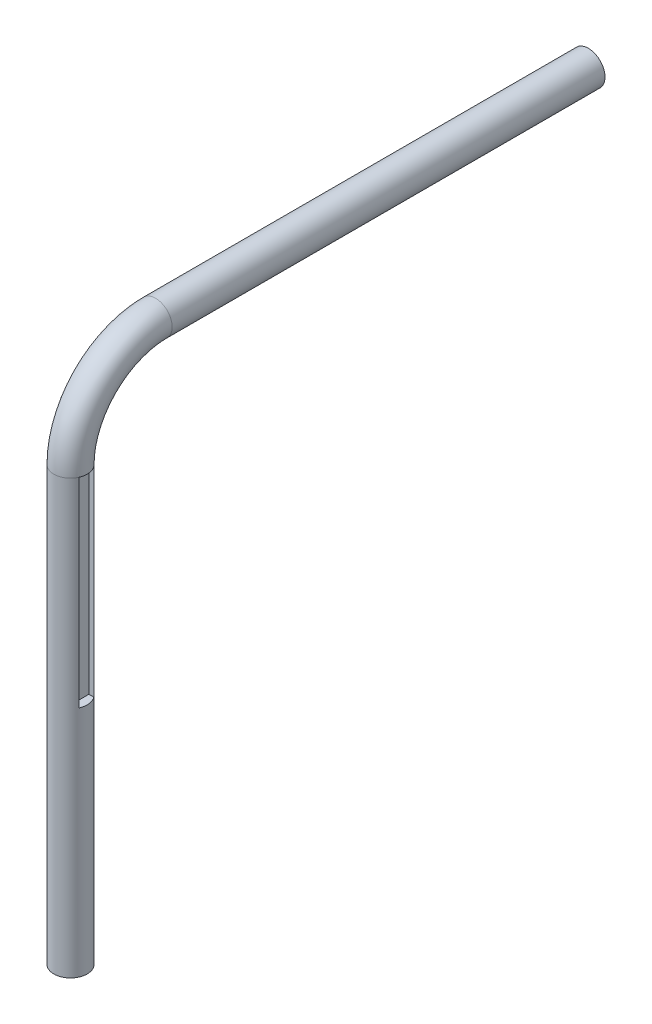
ISO-10303-21;
HEADER;
FILE_DESCRIPTION(('STEP AP214'),'2;1');
FILE_NAME('part.step','',(''),(''),'','','');
FILE_SCHEMA(('AUTOMOTIVE_DESIGN { 1 0 10303 214 1 1 1 1 }'));
ENDSEC;
DATA;
#1=APPLICATION_CONTEXT('core data for automotive mechanical design processes');
#2=APPLICATION_PROTOCOL_DEFINITION('international standard','automotive_design',2000,#1);
#3=PRODUCT_CONTEXT('',#1,'mechanical');
#4=PRODUCT('Part','Part','',(#3));
#5=PRODUCT_RELATED_PRODUCT_CATEGORY('part','',(#4));
#6=PRODUCT_DEFINITION_FORMATION('','',#4);
#7=PRODUCT_DEFINITION_CONTEXT('part definition',#1,'design');
#8=PRODUCT_DEFINITION('design','',#6,#7);
#9=PRODUCT_DEFINITION_SHAPE('','',#8);
#10=(LENGTH_UNIT() NAMED_UNIT(*) SI_UNIT(.MILLI.,.METRE.));
#11=(NAMED_UNIT(*) PLANE_ANGLE_UNIT() SI_UNIT($,.RADIAN.));
#12=(NAMED_UNIT(*) SI_UNIT($,.STERADIAN.) SOLID_ANGLE_UNIT());
#13=UNCERTAINTY_MEASURE_WITH_UNIT(LENGTH_MEASURE(1.E-05),#10,'distance_accuracy_value','');
#14=(GEOMETRIC_REPRESENTATION_CONTEXT(3) GLOBAL_UNCERTAINTY_ASSIGNED_CONTEXT((#13)) GLOBAL_UNIT_ASSIGNED_CONTEXT((#10,
#11,#12)) REPRESENTATION_CONTEXT('',''));
#15=CARTESIAN_POINT('',(0.,0.,0.));
#16=DIRECTION('',(0.,0.,1.));
#17=DIRECTION('',(1.,0.,0.));
#18=AXIS2_PLACEMENT_3D('',#15,#16,#17);
#19=CARTESIAN_POINT('',(0.,0.,0.));
#20=DIRECTION('',(-1.,0.,0.));
#21=DIRECTION('',(0.,0.,1.));
#22=AXIS2_PLACEMENT_3D('',#19,#20,#21);
#23=TOROIDAL_SURFACE('',#22,64.833774641659,12.7);
#24=CARTESIAN_POINT('',(0.,64.833774641659,0.));
#25=DIRECTION('',(0.,0.,-1.));
#26=DIRECTION('',(0.,1.,0.));
#27=AXIS2_PLACEMENT_3D('',#24,#25,#26);
#28=CIRCLE('',#27,12.7);
#29=CARTESIAN_POINT('',(0.,77.533774641659,0.));
#30=VERTEX_POINT('',#29);
#31=EDGE_CURVE('E126',#30,#30,#28,.T.);
#32=ORIENTED_EDGE('',*,*,#31,.F.);
#33=EDGE_LOOP('',(#32));
#34=FACE_BOUND('',#33,.T.);
#35=CARTESIAN_POINT('',(0.,0.,64.833774641659));
#36=DIRECTION('',(0.,-1.,0.));
#37=DIRECTION('',(0.,0.,-1.));
#38=AXIS2_PLACEMENT_3D('',#35,#36,#37);
#39=CIRCLE('',#38,12.7);
#40=CARTESIAN_POINT('',(10.1118547881285,0.,57.15));
#41=VERTEX_POINT('',#40);
#42=CARTESIAN_POINT('',(11.6673683045637,0.,69.85));
#43=VERTEX_POINT('',#42);
#44=EDGE_CURVE('E62',#41,#43,#39,.T.);
#45=ORIENTED_EDGE('',*,*,#44,.F.);
#46=EDGE_CURVE('E121',#43,#41,#39,.T.);
#47=ORIENTED_EDGE('',*,*,#46,.F.);
#48=EDGE_LOOP('',(#45,#47));
#49=FACE_BOUND('',#48,.T.);
#50=ADVANCED_FACE('F39',(#34,#49),#23,.T.);
#51=CARTESIAN_POINT('',(0.,-330.2,64.833774641659));
#52=DIRECTION('',(0.,1.,0.));
#53=DIRECTION('',(0.,0.,1.));
#54=AXIS2_PLACEMENT_3D('',#51,#52,#53);
#55=CYLINDRICAL_SURFACE('',#54,12.7);
#56=CARTESIAN_POINT('',(0.,-330.2,64.833774641659));
#57=DIRECTION('',(0.,-1.,0.));
#58=DIRECTION('',(0.,0.,-1.));
#59=AXIS2_PLACEMENT_3D('',#56,#57,#58);
#60=CIRCLE('',#59,12.7);
#61=CARTESIAN_POINT('',(0.,-330.2,52.133774641659));
#62=VERTEX_POINT('',#61);
#63=EDGE_CURVE('E122',#62,#62,#60,.T.);
#64=ORIENTED_EDGE('',*,*,#63,.F.);
#65=EDGE_LOOP('',(#64));
#66=FACE_BOUND('',#65,.T.);
#67=ORIENTED_EDGE('',*,*,#46,.T.);
#68=DIRECTION('',(0.,1.,0.));
#69=VECTOR('',#68,1.);
#70=CARTESIAN_POINT('',(10.1118547881285,-330.2,57.15));
#71=LINE('',#70,#69);
#72=CARTESIAN_POINT('',(10.1118547881285,-152.4,57.15));
#73=VERTEX_POINT('',#72);
#74=EDGE_CURVE('E11',#41,#73,#71,.F.);
#75=ORIENTED_EDGE('',*,*,#74,.T.);
#76=CARTESIAN_POINT('',(0.,-152.4,64.833774641659));
#77=DIRECTION('',(0.,-1.,0.));
#78=DIRECTION('',(0.,0.,-1.));
#79=AXIS2_PLACEMENT_3D('',#76,#77,#78);
#80=CIRCLE('',#79,12.7);
#81=CARTESIAN_POINT('',(11.6673683045637,-152.4,69.85));
#82=VERTEX_POINT('',#81);
#83=EDGE_CURVE('E132',#73,#82,#80,.T.);
#84=ORIENTED_EDGE('',*,*,#83,.T.);
#85=DIRECTION('',(0.,1.,0.));
#86=VECTOR('',#85,1.);
#87=CARTESIAN_POINT('',(11.6673683045637,-330.2,69.85));
#88=LINE('',#87,#86);
#89=EDGE_CURVE('E47',#82,#43,#88,.T.);
#90=ORIENTED_EDGE('',*,*,#89,.T.);
#91=EDGE_LOOP('',(#67,#75,#84,#90));
#92=FACE_BOUND('',#91,.T.);
#93=ADVANCED_FACE('F138',(#66,#92),#55,.T.);
#94=CARTESIAN_POINT('',(0.,-330.2,64.833774641659));
#95=DIRECTION('',(0.,-1.,0.));
#96=DIRECTION('',(0.,0.,-1.));
#97=AXIS2_PLACEMENT_3D('',#94,#95,#96);
#98=PLANE('',#97);
#99=ORIENTED_EDGE('',*,*,#63,.T.);
#100=EDGE_LOOP('',(#99));
#101=FACE_BOUND('',#100,.T.);
#102=ADVANCED_FACE('F146',(#101),#98,.T.);
#103=CARTESIAN_POINT('',(0.,64.833774641659,-330.2));
#104=DIRECTION('',(0.,0.,1.));
#105=DIRECTION('',(0.,-1.,0.));
#106=AXIS2_PLACEMENT_3D('',#103,#104,#105);
#107=CYLINDRICAL_SURFACE('',#106,12.7);
#108=CARTESIAN_POINT('',(0.,64.833774641659,-330.2));
#109=DIRECTION('',(0.,0.,-1.));
#110=DIRECTION('',(0.,1.,0.));
#111=AXIS2_PLACEMENT_3D('',#108,#109,#110);
#112=CIRCLE('',#111,12.7);
#113=CARTESIAN_POINT('',(0.,77.533774641659,-330.2));
#114=VERTEX_POINT('',#113);
#115=EDGE_CURVE('E112',#114,#114,#112,.T.);
#116=ORIENTED_EDGE('',*,*,#115,.F.);
#117=EDGE_LOOP('',(#116));
#118=FACE_BOUND('',#117,.T.);
#119=ORIENTED_EDGE('',*,*,#31,.T.);
#120=EDGE_LOOP('',(#119));
#121=FACE_BOUND('',#120,.T.);
#122=ADVANCED_FACE('F150',(#118,#121),#107,.T.);
#123=CARTESIAN_POINT('',(0.,64.833774641659,-330.2));
#124=DIRECTION('',(0.,0.,-1.));
#125=DIRECTION('',(0.,1.,0.));
#126=AXIS2_PLACEMENT_3D('',#123,#124,#125);
#127=PLANE('',#126);
#128=ORIENTED_EDGE('',*,*,#115,.T.);
#129=EDGE_LOOP('',(#128));
#130=FACE_BOUND('',#129,.T.);
#131=ADVANCED_FACE('F152',(#130),#127,.T.);
#132=CARTESIAN_POINT('',(6.35,0.,69.85));
#133=DIRECTION('',(0.,0.,1.));
#134=DIRECTION('',(0.,-1.,0.));
#135=AXIS2_PLACEMENT_3D('',#132,#133,#134);
#136=PLANE('',#135);
#137=DIRECTION('',(1.,0.,0.));
#138=VECTOR('',#137,1.);
#139=CARTESIAN_POINT('',(6.35,-152.4,69.85));
#140=LINE('',#139,#138);
#141=CARTESIAN_POINT('',(6.35,-152.4,69.85));
#142=VERTEX_POINT('',#141);
#143=EDGE_CURVE('E54',#142,#82,#140,.T.);
#144=ORIENTED_EDGE('',*,*,#143,.F.);
#145=DIRECTION('',(0.,-1.,0.));
#146=VECTOR('',#145,1.);
#147=CARTESIAN_POINT('',(6.35,0.,69.85));
#148=LINE('',#147,#146);
#149=CARTESIAN_POINT('',(6.35,0.,69.85));
#150=VERTEX_POINT('',#149);
#151=EDGE_CURVE('E82',#150,#142,#148,.T.);
#152=ORIENTED_EDGE('',*,*,#151,.F.);
#153=DIRECTION('',(1.,0.,0.));
#154=VECTOR('',#153,1.);
#155=CARTESIAN_POINT('',(6.35,0.,69.85));
#156=LINE('',#155,#154);
#157=EDGE_CURVE('E109',#150,#43,#156,.T.);
#158=ORIENTED_EDGE('',*,*,#157,.T.);
#159=ORIENTED_EDGE('',*,*,#89,.F.);
#160=EDGE_LOOP('',(#144,#152,#158,#159));
#161=FACE_BOUND('',#160,.T.);
#162=ADVANCED_FACE('F80',(#161),#136,.F.);
#163=CARTESIAN_POINT('',(6.35,0.,69.85));
#164=DIRECTION('',(0.,1.,0.));
#165=DIRECTION('',(0.,0.,1.));
#166=AXIS2_PLACEMENT_3D('',#163,#164,#165);
#167=PLANE('',#166);
#168=ORIENTED_EDGE('',*,*,#157,.F.);
#169=DIRECTION('',(0.,0.,1.));
#170=VECTOR('',#169,1.);
#171=CARTESIAN_POINT('',(6.35,0.,69.85));
#172=LINE('',#171,#170);
#173=CARTESIAN_POINT('',(6.35,0.,57.15));
#174=VERTEX_POINT('',#173);
#175=EDGE_CURVE('E88',#174,#150,#172,.T.);
#176=ORIENTED_EDGE('',*,*,#175,.F.);
#177=DIRECTION('',(1.,0.,0.));
#178=VECTOR('',#177,1.);
#179=CARTESIAN_POINT('',(6.35,0.,57.15));
#180=LINE('',#179,#178);
#181=EDGE_CURVE('E113',#174,#41,#180,.T.);
#182=ORIENTED_EDGE('',*,*,#181,.T.);
#183=ORIENTED_EDGE('',*,*,#44,.T.);
#184=EDGE_LOOP('',(#168,#176,#182,#183));
#185=FACE_BOUND('',#184,.T.);
#186=ADVANCED_FACE('F167',(#185),#167,.F.);
#187=CARTESIAN_POINT('',(6.35,0.,57.15));
#188=DIRECTION('',(0.,0.,-1.));
#189=DIRECTION('',(0.,1.,0.));
#190=AXIS2_PLACEMENT_3D('',#187,#188,#189);
#191=PLANE('',#190);
#192=ORIENTED_EDGE('',*,*,#181,.F.);
#193=DIRECTION('',(0.,1.,0.));
#194=VECTOR('',#193,1.);
#195=CARTESIAN_POINT('',(6.35,0.,57.15));
#196=LINE('',#195,#194);
#197=CARTESIAN_POINT('',(6.35,-152.4,57.15));
#198=VERTEX_POINT('',#197);
#199=EDGE_CURVE('E98',#198,#174,#196,.T.);
#200=ORIENTED_EDGE('',*,*,#199,.F.);
#201=DIRECTION('',(1.,0.,0.));
#202=VECTOR('',#201,1.);
#203=CARTESIAN_POINT('',(6.35,-152.4,57.15));
#204=LINE('',#203,#202);
#205=EDGE_CURVE('E87',#198,#73,#204,.T.);
#206=ORIENTED_EDGE('',*,*,#205,.T.);
#207=ORIENTED_EDGE('',*,*,#74,.F.);
#208=EDGE_LOOP('',(#192,#200,#206,#207));
#209=FACE_BOUND('',#208,.T.);
#210=ADVANCED_FACE('F170',(#209),#191,.F.);
#211=CARTESIAN_POINT('',(6.35,-152.4,69.85));
#212=DIRECTION('',(0.,-1.,0.));
#213=DIRECTION('',(0.,0.,-1.));
#214=AXIS2_PLACEMENT_3D('',#211,#212,#213);
#215=PLANE('',#214);
#216=ORIENTED_EDGE('',*,*,#205,.F.);
#217=DIRECTION('',(0.,0.,-1.));
#218=VECTOR('',#217,1.);
#219=CARTESIAN_POINT('',(6.35,-152.4,69.85));
#220=LINE('',#219,#218);
#221=EDGE_CURVE('E91',#142,#198,#220,.T.);
#222=ORIENTED_EDGE('',*,*,#221,.F.);
#223=ORIENTED_EDGE('',*,*,#143,.T.);
#224=ORIENTED_EDGE('',*,*,#83,.F.);
#225=EDGE_LOOP('',(#216,#222,#223,#224));
#226=FACE_BOUND('',#225,.T.);
#227=ADVANCED_FACE('F92',(#226),#215,.F.);
#228=CARTESIAN_POINT('',(6.35,0.,0.));
#229=DIRECTION('',(1.,0.,0.));
#230=DIRECTION('',(0.,0.,-1.));
#231=AXIS2_PLACEMENT_3D('',#228,#229,#230);
#232=PLANE('',#231);
#233=ORIENTED_EDGE('',*,*,#151,.T.);
#234=ORIENTED_EDGE('',*,*,#221,.T.);
#235=ORIENTED_EDGE('',*,*,#199,.T.);
#236=ORIENTED_EDGE('',*,*,#175,.T.);
#237=EDGE_LOOP('',(#233,#234,#235,#236));
#238=FACE_BOUND('',#237,.T.);
#239=ADVANCED_FACE('F100',(#238),#232,.T.);
#240=CLOSED_SHELL('',(#50,#93,#102,#122,#131,#162,#186,#210,#227,#239));
#241=MANIFOLD_SOLID_BREP('B2',#240);
#242=ADVANCED_BREP_SHAPE_REPRESENTATION('',(#18,#241),#14);
#243=SHAPE_DEFINITION_REPRESENTATION(#9,#242);
ENDSEC;
END-ISO-10303-21;
